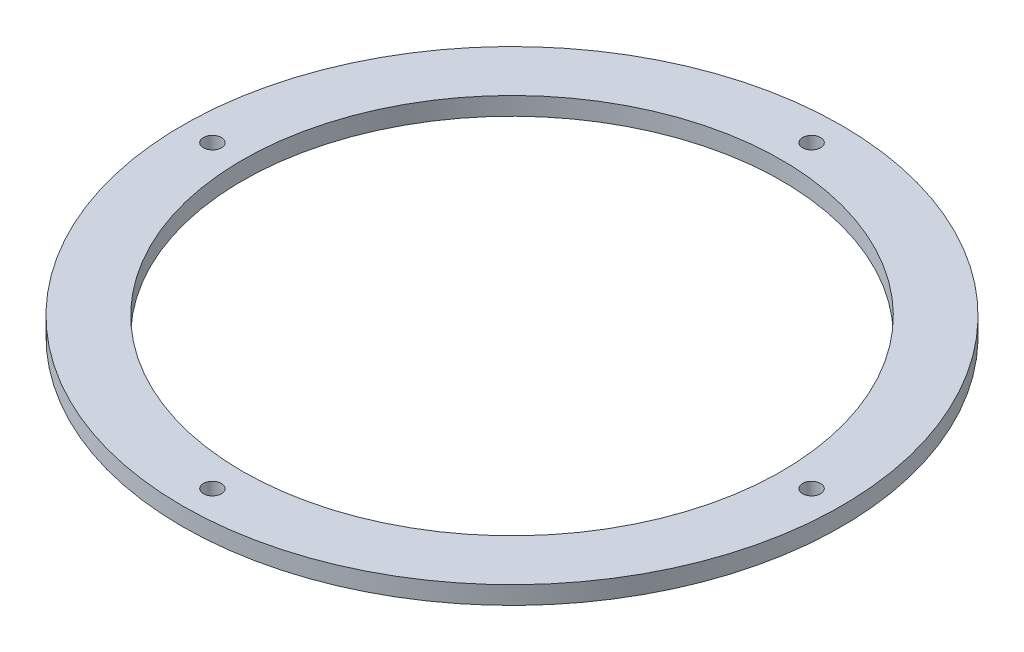
ISO-10303-21;
HEADER;
FILE_DESCRIPTION(('STEP AP214'),'2;1');
FILE_NAME('part.step','',(''),(''),'','','');
FILE_SCHEMA(('AUTOMOTIVE_DESIGN { 1 0 10303 214 1 1 1 1 }'));
ENDSEC;
DATA;
#1=APPLICATION_CONTEXT('core data for automotive mechanical design processes');
#2=APPLICATION_PROTOCOL_DEFINITION('international standard','automotive_design',2000,#1);
#3=PRODUCT_CONTEXT('',#1,'mechanical');
#4=PRODUCT('Part','Part','',(#3));
#5=PRODUCT_RELATED_PRODUCT_CATEGORY('part','',(#4));
#6=PRODUCT_DEFINITION_FORMATION('','',#4);
#7=PRODUCT_DEFINITION_CONTEXT('part definition',#1,'design');
#8=PRODUCT_DEFINITION('design','',#6,#7);
#9=PRODUCT_DEFINITION_SHAPE('','',#8);
#10=(LENGTH_UNIT() NAMED_UNIT(*) SI_UNIT(.MILLI.,.METRE.));
#11=(NAMED_UNIT(*) PLANE_ANGLE_UNIT() SI_UNIT($,.RADIAN.));
#12=(NAMED_UNIT(*) SI_UNIT($,.STERADIAN.) SOLID_ANGLE_UNIT());
#13=UNCERTAINTY_MEASURE_WITH_UNIT(LENGTH_MEASURE(1.E-05),#10,'distance_accuracy_value','');
#14=(GEOMETRIC_REPRESENTATION_CONTEXT(3) GLOBAL_UNCERTAINTY_ASSIGNED_CONTEXT((#13)) GLOBAL_UNIT_ASSIGNED_CONTEXT((#10,
#11,#12)) REPRESENTATION_CONTEXT('',''));
#15=CARTESIAN_POINT('',(0.,0.,0.));
#16=DIRECTION('',(0.,0.,1.));
#17=DIRECTION('',(1.,0.,0.));
#18=AXIS2_PLACEMENT_3D('',#15,#16,#17);
#19=CARTESIAN_POINT('',(0.,3.,0.));
#20=DIRECTION('',(0.,-1.,0.));
#21=DIRECTION('',(0.,0.,-1.));
#22=AXIS2_PLACEMENT_3D('',#19,#20,#21);
#23=CYLINDRICAL_SURFACE('',#22,45.);
#24=CARTESIAN_POINT('',(0.,3.,0.));
#25=DIRECTION('',(0.,1.,0.));
#26=DIRECTION('',(0.,0.,1.));
#27=AXIS2_PLACEMENT_3D('',#24,#25,#26);
#28=CIRCLE('',#27,45.);
#29=CARTESIAN_POINT('',(0.,3.,45.));
#30=VERTEX_POINT('',#29);
#31=EDGE_CURVE('E52',#30,#30,#28,.T.);
#32=ORIENTED_EDGE('',*,*,#31,.T.);
#33=EDGE_LOOP('',(#32));
#34=FACE_BOUND('',#33,.T.);
#35=CARTESIAN_POINT('',(0.,0.,0.));
#36=DIRECTION('',(0.,1.,0.));
#37=DIRECTION('',(0.,0.,1.));
#38=AXIS2_PLACEMENT_3D('',#35,#36,#37);
#39=CIRCLE('',#38,45.);
#40=CARTESIAN_POINT('',(0.,0.,45.));
#41=VERTEX_POINT('',#40);
#42=EDGE_CURVE('E77',#41,#41,#39,.T.);
#43=ORIENTED_EDGE('',*,*,#42,.F.);
#44=EDGE_LOOP('',(#43));
#45=FACE_BOUND('',#44,.T.);
#46=ADVANCED_FACE('F43',(#34,#45),#23,.F.);
#47=CARTESIAN_POINT('',(0.,3.,-50.));
#48=DIRECTION('',(0.,-1.,0.));
#49=DIRECTION('',(0.,0.,-1.));
#50=AXIS2_PLACEMENT_3D('',#47,#48,#49);
#51=CYLINDRICAL_SURFACE('',#50,1.5);
#52=CARTESIAN_POINT('',(0.,3.,-50.));
#53=DIRECTION('',(0.,1.,0.));
#54=DIRECTION('',(0.,0.,1.));
#55=AXIS2_PLACEMENT_3D('',#52,#53,#54);
#56=CIRCLE('',#55,1.5);
#57=CARTESIAN_POINT('',(0.,3.,-48.5));
#58=VERTEX_POINT('',#57);
#59=EDGE_CURVE('E58',#58,#58,#56,.T.);
#60=ORIENTED_EDGE('',*,*,#59,.T.);
#61=EDGE_LOOP('',(#60));
#62=FACE_BOUND('',#61,.T.);
#63=CARTESIAN_POINT('',(0.,0.,-50.));
#64=DIRECTION('',(0.,1.,0.));
#65=DIRECTION('',(0.,0.,1.));
#66=AXIS2_PLACEMENT_3D('',#63,#64,#65);
#67=CIRCLE('',#66,1.5);
#68=CARTESIAN_POINT('',(0.,0.,-48.5));
#69=VERTEX_POINT('',#68);
#70=EDGE_CURVE('E74',#69,#69,#67,.T.);
#71=ORIENTED_EDGE('',*,*,#70,.F.);
#72=EDGE_LOOP('',(#71));
#73=FACE_BOUND('',#72,.T.);
#74=ADVANCED_FACE('F104',(#62,#73),#51,.F.);
#75=CARTESIAN_POINT('',(50.,3.,1.74574066942157E-13));
#76=DIRECTION('',(0.,-1.,0.));
#77=DIRECTION('',(0.,0.,-1.));
#78=AXIS2_PLACEMENT_3D('',#75,#76,#77);
#79=CYLINDRICAL_SURFACE('',#78,1.5);
#80=CARTESIAN_POINT('',(50.,3.,1.74574066942157E-13));
#81=DIRECTION('',(0.,1.,0.));
#82=DIRECTION('',(0.,0.,1.));
#83=AXIS2_PLACEMENT_3D('',#80,#81,#82);
#84=CIRCLE('',#83,1.5);
#85=CARTESIAN_POINT('',(50.,3.,1.50000000000017));
#86=VERTEX_POINT('',#85);
#87=EDGE_CURVE('E95',#86,#86,#84,.T.);
#88=ORIENTED_EDGE('',*,*,#87,.T.);
#89=EDGE_LOOP('',(#88));
#90=FACE_BOUND('',#89,.T.);
#91=CARTESIAN_POINT('',(50.,0.,1.74574066942157E-13));
#92=DIRECTION('',(0.,1.,0.));
#93=DIRECTION('',(0.,0.,1.));
#94=AXIS2_PLACEMENT_3D('',#91,#92,#93);
#95=CIRCLE('',#94,1.5);
#96=CARTESIAN_POINT('',(50.,0.,1.50000000000017));
#97=VERTEX_POINT('',#96);
#98=EDGE_CURVE('E70',#97,#97,#95,.T.);
#99=ORIENTED_EDGE('',*,*,#98,.F.);
#100=EDGE_LOOP('',(#99));
#101=FACE_BOUND('',#100,.T.);
#102=ADVANCED_FACE('F122',(#90,#101),#79,.F.);
#103=CARTESIAN_POINT('',(-3.49148133884313E-13,3.,50.));
#104=DIRECTION('',(0.,-1.,0.));
#105=DIRECTION('',(0.,0.,-1.));
#106=AXIS2_PLACEMENT_3D('',#103,#104,#105);
#107=CYLINDRICAL_SURFACE('',#106,1.5);
#108=CARTESIAN_POINT('',(-3.49148133884313E-13,3.,50.));
#109=DIRECTION('',(0.,1.,0.));
#110=DIRECTION('',(0.,0.,1.));
#111=AXIS2_PLACEMENT_3D('',#108,#109,#110);
#112=CIRCLE('',#111,1.5);
#113=CARTESIAN_POINT('',(-3.49148133884313E-13,3.,51.5));
#114=VERTEX_POINT('',#113);
#115=EDGE_CURVE('E89',#114,#114,#112,.T.);
#116=ORIENTED_EDGE('',*,*,#115,.T.);
#117=EDGE_LOOP('',(#116));
#118=FACE_BOUND('',#117,.T.);
#119=CARTESIAN_POINT('',(-3.49148133884313E-13,0.,50.));
#120=DIRECTION('',(0.,1.,0.));
#121=DIRECTION('',(0.,0.,1.));
#122=AXIS2_PLACEMENT_3D('',#119,#120,#121);
#123=CIRCLE('',#122,1.5);
#124=CARTESIAN_POINT('',(-3.49148133884313E-13,0.,51.5));
#125=VERTEX_POINT('',#124);
#126=EDGE_CURVE('E66',#125,#125,#123,.T.);
#127=ORIENTED_EDGE('',*,*,#126,.F.);
#128=EDGE_LOOP('',(#127));
#129=FACE_BOUND('',#128,.T.);
#130=ADVANCED_FACE('F128',(#118,#129),#107,.F.);
#131=CARTESIAN_POINT('',(-50.,3.,-5.2372220082647E-13));
#132=DIRECTION('',(0.,-1.,0.));
#133=DIRECTION('',(0.,0.,-1.));
#134=AXIS2_PLACEMENT_3D('',#131,#132,#133);
#135=CYLINDRICAL_SURFACE('',#134,1.5);
#136=CARTESIAN_POINT('',(-50.,3.,-5.2372220082647E-13));
#137=DIRECTION('',(0.,1.,0.));
#138=DIRECTION('',(0.,0.,1.));
#139=AXIS2_PLACEMENT_3D('',#136,#137,#138);
#140=CIRCLE('',#139,1.5);
#141=CARTESIAN_POINT('',(-50.,3.,1.49999999999948));
#142=VERTEX_POINT('',#141);
#143=EDGE_CURVE('E84',#142,#142,#140,.T.);
#144=ORIENTED_EDGE('',*,*,#143,.T.);
#145=EDGE_LOOP('',(#144));
#146=FACE_BOUND('',#145,.T.);
#147=CARTESIAN_POINT('',(-50.,0.,-5.2372220082647E-13));
#148=DIRECTION('',(0.,1.,0.));
#149=DIRECTION('',(0.,0.,1.));
#150=AXIS2_PLACEMENT_3D('',#147,#148,#149);
#151=CIRCLE('',#150,1.5);
#152=CARTESIAN_POINT('',(-50.,0.,1.49999999999948));
#153=VERTEX_POINT('',#152);
#154=EDGE_CURVE('E62',#153,#153,#151,.T.);
#155=ORIENTED_EDGE('',*,*,#154,.F.);
#156=EDGE_LOOP('',(#155));
#157=FACE_BOUND('',#156,.T.);
#158=ADVANCED_FACE('F45',(#146,#157),#135,.F.);
#159=CARTESIAN_POINT('',(0.,3.,0.));
#160=DIRECTION('',(0.,-1.,0.));
#161=DIRECTION('',(0.,0.,-1.));
#162=AXIS2_PLACEMENT_3D('',#159,#160,#161);
#163=CYLINDRICAL_SURFACE('',#162,55.);
#164=CARTESIAN_POINT('',(0.,3.,0.));
#165=DIRECTION('',(0.,1.,0.));
#166=DIRECTION('',(0.,0.,1.));
#167=AXIS2_PLACEMENT_3D('',#164,#165,#166);
#168=CIRCLE('',#167,55.);
#169=CARTESIAN_POINT('',(0.,3.,55.));
#170=VERTEX_POINT('',#169);
#171=EDGE_CURVE('E10',#170,#170,#168,.T.);
#172=ORIENTED_EDGE('',*,*,#171,.F.);
#173=EDGE_LOOP('',(#172));
#174=FACE_BOUND('',#173,.T.);
#175=CARTESIAN_POINT('',(0.,0.,0.));
#176=DIRECTION('',(0.,1.,0.));
#177=DIRECTION('',(0.,0.,1.));
#178=AXIS2_PLACEMENT_3D('',#175,#176,#177);
#179=CIRCLE('',#178,55.);
#180=CARTESIAN_POINT('',(0.,0.,55.));
#181=VERTEX_POINT('',#180);
#182=EDGE_CURVE('E47',#181,#181,#179,.T.);
#183=ORIENTED_EDGE('',*,*,#182,.T.);
#184=EDGE_LOOP('',(#183));
#185=FACE_BOUND('',#184,.T.);
#186=ADVANCED_FACE('F111',(#174,#185),#163,.T.);
#187=CARTESIAN_POINT('',(0.,3.,0.));
#188=DIRECTION('',(0.,1.,0.));
#189=DIRECTION('',(0.,0.,1.));
#190=AXIS2_PLACEMENT_3D('',#187,#188,#189);
#191=PLANE('',#190);
#192=ORIENTED_EDGE('',*,*,#143,.F.);
#193=EDGE_LOOP('',(#192));
#194=FACE_BOUND('',#193,.T.);
#195=ORIENTED_EDGE('',*,*,#115,.F.);
#196=EDGE_LOOP('',(#195));
#197=FACE_BOUND('',#196,.T.);
#198=ORIENTED_EDGE('',*,*,#87,.F.);
#199=EDGE_LOOP('',(#198));
#200=FACE_BOUND('',#199,.T.);
#201=ORIENTED_EDGE('',*,*,#59,.F.);
#202=EDGE_LOOP('',(#201));
#203=FACE_BOUND('',#202,.T.);
#204=ORIENTED_EDGE('',*,*,#31,.F.);
#205=EDGE_LOOP('',(#204));
#206=FACE_BOUND('',#205,.T.);
#207=ORIENTED_EDGE('',*,*,#171,.T.);
#208=EDGE_LOOP('',(#207));
#209=FACE_BOUND('',#208,.T.);
#210=ADVANCED_FACE('F107',(#194,#197,#200,#203,#206,#209),#191,.T.);
#211=CARTESIAN_POINT('',(0.,0.,0.));
#212=DIRECTION('',(0.,1.,0.));
#213=DIRECTION('',(0.,0.,1.));
#214=AXIS2_PLACEMENT_3D('',#211,#212,#213);
#215=PLANE('',#214);
#216=ORIENTED_EDGE('',*,*,#154,.T.);
#217=EDGE_LOOP('',(#216));
#218=FACE_BOUND('',#217,.T.);
#219=ORIENTED_EDGE('',*,*,#126,.T.);
#220=EDGE_LOOP('',(#219));
#221=FACE_BOUND('',#220,.T.);
#222=ORIENTED_EDGE('',*,*,#98,.T.);
#223=EDGE_LOOP('',(#222));
#224=FACE_BOUND('',#223,.T.);
#225=ORIENTED_EDGE('',*,*,#70,.T.);
#226=EDGE_LOOP('',(#225));
#227=FACE_BOUND('',#226,.T.);
#228=ORIENTED_EDGE('',*,*,#42,.T.);
#229=EDGE_LOOP('',(#228));
#230=FACE_BOUND('',#229,.T.);
#231=ORIENTED_EDGE('',*,*,#182,.F.);
#232=EDGE_LOOP('',(#231));
#233=FACE_BOUND('',#232,.T.);
#234=ADVANCED_FACE('F110',(#218,#221,#224,#227,#230,#233),#215,.F.);
#235=CLOSED_SHELL('',(#46,#74,#102,#130,#158,#186,#210,#234));
#236=MANIFOLD_SOLID_BREP('B2',#235);
#237=ADVANCED_BREP_SHAPE_REPRESENTATION('',(#18,#236),#14);
#238=SHAPE_DEFINITION_REPRESENTATION(#9,#237);
ENDSEC;
END-ISO-10303-21;
